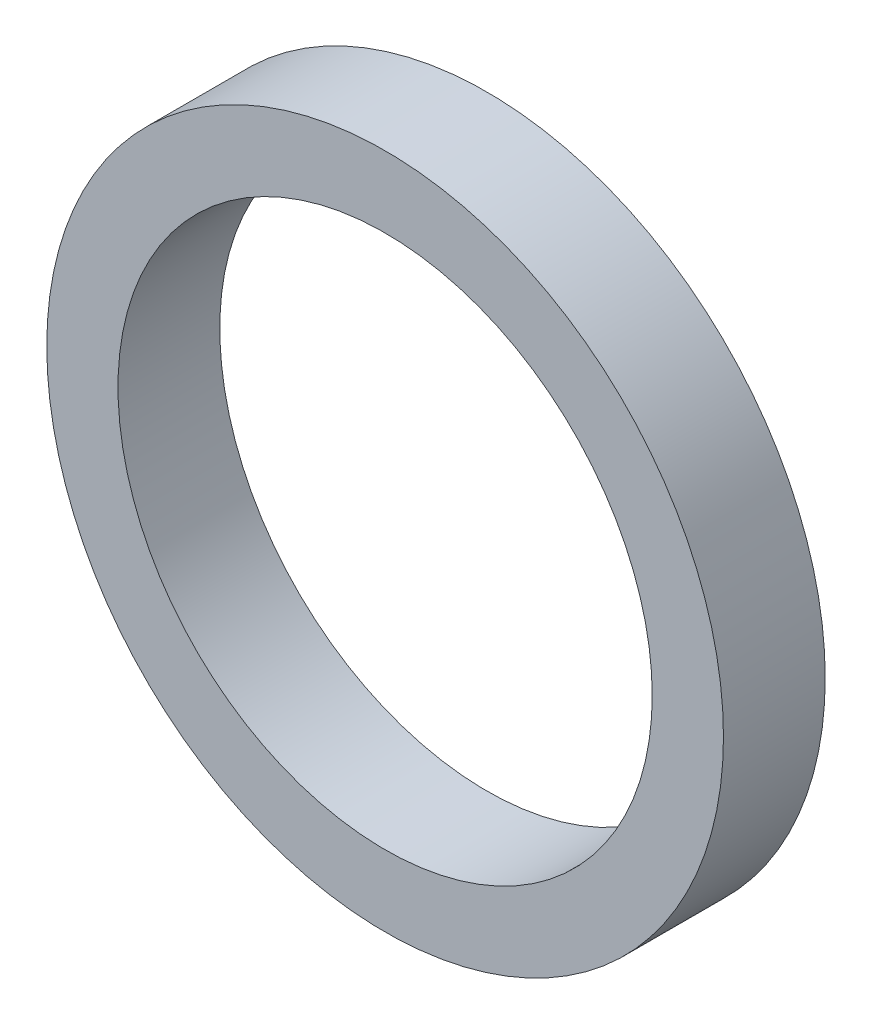
ISO-10303-21;
HEADER;
FILE_DESCRIPTION(('STEP AP214'),'2;1');
FILE_NAME('part.step','',(''),(''),'','','');
FILE_SCHEMA(('AUTOMOTIVE_DESIGN { 1 0 10303 214 1 1 1 1 }'));
ENDSEC;
DATA;
#1=APPLICATION_CONTEXT('core data for automotive mechanical design processes');
#2=APPLICATION_PROTOCOL_DEFINITION('international standard','automotive_design',2000,#1);
#3=PRODUCT_CONTEXT('',#1,'mechanical');
#4=PRODUCT('Part','Part','',(#3));
#5=PRODUCT_RELATED_PRODUCT_CATEGORY('part','',(#4));
#6=PRODUCT_DEFINITION_FORMATION('','',#4);
#7=PRODUCT_DEFINITION_CONTEXT('part definition',#1,'design');
#8=PRODUCT_DEFINITION('design','',#6,#7);
#9=PRODUCT_DEFINITION_SHAPE('','',#8);
#10=(LENGTH_UNIT() NAMED_UNIT(*) SI_UNIT(.MILLI.,.METRE.));
#11=(NAMED_UNIT(*) PLANE_ANGLE_UNIT() SI_UNIT($,.RADIAN.));
#12=(NAMED_UNIT(*) SI_UNIT($,.STERADIAN.) SOLID_ANGLE_UNIT());
#13=UNCERTAINTY_MEASURE_WITH_UNIT(LENGTH_MEASURE(1.E-05),#10,'distance_accuracy_value','');
#14=(GEOMETRIC_REPRESENTATION_CONTEXT(3) GLOBAL_UNCERTAINTY_ASSIGNED_CONTEXT((#13)) GLOBAL_UNIT_ASSIGNED_CONTEXT((#10,
#11,#12)) REPRESENTATION_CONTEXT('',''));
#15=CARTESIAN_POINT('',(0.,0.,0.));
#16=DIRECTION('',(0.,0.,1.));
#17=DIRECTION('',(1.,0.,0.));
#18=AXIS2_PLACEMENT_3D('',#15,#16,#17);
#19=CARTESIAN_POINT('',(32.5,0.,4.));
#20=DIRECTION('',(0.,0.,1.));
#21=DIRECTION('',(1.,0.,0.));
#22=AXIS2_PLACEMENT_3D('',#19,#20,#21);
#23=PLANE('',#22);
#24=CARTESIAN_POINT('',(32.5,0.,4.));
#25=DIRECTION('',(0.,0.,1.));
#26=DIRECTION('',(1.,0.,0.));
#27=AXIS2_PLACEMENT_3D('',#24,#25,#26);
#28=CIRCLE('',#27,3.325);
#29=CARTESIAN_POINT('',(35.825,0.,4.));
#30=VERTEX_POINT('',#29);
#31=EDGE_CURVE('E10',#30,#30,#28,.T.);
#32=ORIENTED_EDGE('',*,*,#31,.T.);
#33=EDGE_LOOP('',(#32));
#34=FACE_BOUND('',#33,.T.);
#35=CARTESIAN_POINT('',(32.5,0.,4.));
#36=DIRECTION('',(0.,0.,1.));
#37=DIRECTION('',(1.,0.,0.));
#38=AXIS2_PLACEMENT_3D('',#35,#36,#37);
#39=CIRCLE('',#38,2.625);
#40=CARTESIAN_POINT('',(35.125,0.,4.));
#41=VERTEX_POINT('',#40);
#42=EDGE_CURVE('E50',#41,#41,#39,.T.);
#43=ORIENTED_EDGE('',*,*,#42,.F.);
#44=EDGE_LOOP('',(#43));
#45=FACE_BOUND('',#44,.T.);
#46=ADVANCED_FACE('F39',(#34,#45),#23,.T.);
#47=CARTESIAN_POINT('',(32.5,0.,3.));
#48=DIRECTION('',(0.,0.,1.));
#49=DIRECTION('',(1.,0.,0.));
#50=AXIS2_PLACEMENT_3D('',#47,#48,#49);
#51=PLANE('',#50);
#52=CARTESIAN_POINT('',(32.5,0.,3.));
#53=DIRECTION('',(0.,0.,1.));
#54=DIRECTION('',(1.,0.,0.));
#55=AXIS2_PLACEMENT_3D('',#52,#53,#54);
#56=CIRCLE('',#55,3.325);
#57=CARTESIAN_POINT('',(35.825,0.,3.));
#58=VERTEX_POINT('',#57);
#59=EDGE_CURVE('E43',#58,#58,#56,.T.);
#60=ORIENTED_EDGE('',*,*,#59,.F.);
#61=EDGE_LOOP('',(#60));
#62=FACE_BOUND('',#61,.T.);
#63=CARTESIAN_POINT('',(32.5,0.,3.));
#64=DIRECTION('',(0.,0.,1.));
#65=DIRECTION('',(1.,0.,0.));
#66=AXIS2_PLACEMENT_3D('',#63,#64,#65);
#67=CIRCLE('',#66,2.625);
#68=CARTESIAN_POINT('',(35.125,0.,3.));
#69=VERTEX_POINT('',#68);
#70=EDGE_CURVE('E52',#69,#69,#67,.T.);
#71=ORIENTED_EDGE('',*,*,#70,.T.);
#72=EDGE_LOOP('',(#71));
#73=FACE_BOUND('',#72,.T.);
#74=ADVANCED_FACE('F62',(#62,#73),#51,.F.);
#75=CARTESIAN_POINT('',(32.5,0.,4.));
#76=DIRECTION('',(0.,0.,-1.));
#77=DIRECTION('',(-1.,0.,0.));
#78=AXIS2_PLACEMENT_3D('',#75,#76,#77);
#79=CYLINDRICAL_SURFACE('',#78,3.325);
#80=ORIENTED_EDGE('',*,*,#31,.F.);
#81=EDGE_LOOP('',(#80));
#82=FACE_BOUND('',#81,.T.);
#83=ORIENTED_EDGE('',*,*,#59,.T.);
#84=EDGE_LOOP('',(#83));
#85=FACE_BOUND('',#84,.T.);
#86=ADVANCED_FACE('F41',(#82,#85),#79,.T.);
#87=CARTESIAN_POINT('',(32.5,0.,4.));
#88=DIRECTION('',(0.,0.,-1.));
#89=DIRECTION('',(-1.,0.,0.));
#90=AXIS2_PLACEMENT_3D('',#87,#88,#89);
#91=CYLINDRICAL_SURFACE('',#90,2.625);
#92=ORIENTED_EDGE('',*,*,#42,.T.);
#93=EDGE_LOOP('',(#92));
#94=FACE_BOUND('',#93,.T.);
#95=ORIENTED_EDGE('',*,*,#70,.F.);
#96=EDGE_LOOP('',(#95));
#97=FACE_BOUND('',#96,.T.);
#98=ADVANCED_FACE('F58',(#94,#97),#91,.F.);
#99=CLOSED_SHELL('',(#46,#74,#86,#98));
#100=MANIFOLD_SOLID_BREP('B2',#99);
#101=ADVANCED_BREP_SHAPE_REPRESENTATION('',(#18,#100),#14);
#102=SHAPE_DEFINITION_REPRESENTATION(#9,#101);
ENDSEC;
END-ISO-10303-21;
